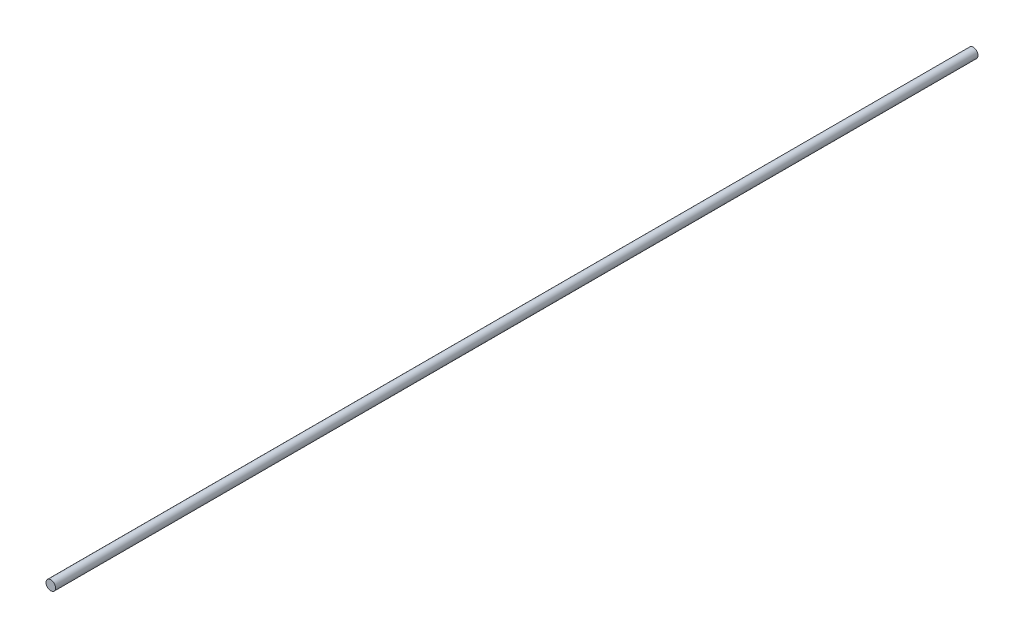
ISO-10303-21;
HEADER;
FILE_DESCRIPTION(('STEP AP214'),'2;1');
FILE_NAME('part.step','',(''),(''),'','','');
FILE_SCHEMA(('AUTOMOTIVE_DESIGN { 1 0 10303 214 1 1 1 1 }'));
ENDSEC;
DATA;
#1=APPLICATION_CONTEXT('core data for automotive mechanical design processes');
#2=APPLICATION_PROTOCOL_DEFINITION('international standard','automotive_design',2000,#1);
#3=PRODUCT_CONTEXT('',#1,'mechanical');
#4=PRODUCT('Part','Part','',(#3));
#5=PRODUCT_RELATED_PRODUCT_CATEGORY('part','',(#4));
#6=PRODUCT_DEFINITION_FORMATION('','',#4);
#7=PRODUCT_DEFINITION_CONTEXT('part definition',#1,'design');
#8=PRODUCT_DEFINITION('design','',#6,#7);
#9=PRODUCT_DEFINITION_SHAPE('','',#8);
#10=(LENGTH_UNIT() NAMED_UNIT(*) SI_UNIT(.MILLI.,.METRE.));
#11=(NAMED_UNIT(*) PLANE_ANGLE_UNIT() SI_UNIT($,.RADIAN.));
#12=(NAMED_UNIT(*) SI_UNIT($,.STERADIAN.) SOLID_ANGLE_UNIT());
#13=UNCERTAINTY_MEASURE_WITH_UNIT(LENGTH_MEASURE(1.E-05),#10,'distance_accuracy_value','');
#14=(GEOMETRIC_REPRESENTATION_CONTEXT(3) GLOBAL_UNCERTAINTY_ASSIGNED_CONTEXT((#13)) GLOBAL_UNIT_ASSIGNED_CONTEXT((#10,
#11,#12)) REPRESENTATION_CONTEXT('',''));
#15=CARTESIAN_POINT('',(0.,0.,0.));
#16=DIRECTION('',(0.,0.,1.));
#17=DIRECTION('',(1.,0.,0.));
#18=AXIS2_PLACEMENT_3D('',#15,#16,#17);
#19=CARTESIAN_POINT('',(0.,0.,770.));
#20=DIRECTION('',(0.,0.,-1.));
#21=DIRECTION('',(-1.,0.,0.));
#22=AXIS2_PLACEMENT_3D('',#19,#20,#21);
#23=CYLINDRICAL_SURFACE('',#22,4.);
#24=CARTESIAN_POINT('',(0.,0.,770.));
#25=DIRECTION('',(0.,0.,1.));
#26=DIRECTION('',(1.,0.,0.));
#27=AXIS2_PLACEMENT_3D('',#24,#25,#26);
#28=CIRCLE('',#27,4.);
#29=CARTESIAN_POINT('',(4.,0.,770.));
#30=VERTEX_POINT('',#29);
#31=EDGE_CURVE('E10',#30,#30,#28,.T.);
#32=ORIENTED_EDGE('',*,*,#31,.F.);
#33=EDGE_LOOP('',(#32));
#34=FACE_BOUND('',#33,.T.);
#35=CARTESIAN_POINT('',(0.,0.,0.));
#36=DIRECTION('',(0.,0.,1.));
#37=DIRECTION('',(1.,0.,0.));
#38=AXIS2_PLACEMENT_3D('',#35,#36,#37);
#39=CIRCLE('',#38,4.);
#40=CARTESIAN_POINT('',(4.,0.,0.));
#41=VERTEX_POINT('',#40);
#42=EDGE_CURVE('E39',#41,#41,#39,.T.);
#43=ORIENTED_EDGE('',*,*,#42,.T.);
#44=EDGE_LOOP('',(#43));
#45=FACE_BOUND('',#44,.T.);
#46=ADVANCED_FACE('F36',(#34,#45),#23,.T.);
#47=CARTESIAN_POINT('',(0.,0.,770.));
#48=DIRECTION('',(0.,0.,1.));
#49=DIRECTION('',(1.,0.,0.));
#50=AXIS2_PLACEMENT_3D('',#47,#48,#49);
#51=PLANE('',#50);
#52=ORIENTED_EDGE('',*,*,#31,.T.);
#53=EDGE_LOOP('',(#52));
#54=FACE_BOUND('',#53,.T.);
#55=ADVANCED_FACE('F51',(#54),#51,.T.);
#56=CARTESIAN_POINT('',(0.,0.,0.));
#57=DIRECTION('',(0.,0.,1.));
#58=DIRECTION('',(1.,0.,0.));
#59=AXIS2_PLACEMENT_3D('',#56,#57,#58);
#60=PLANE('',#59);
#61=ORIENTED_EDGE('',*,*,#42,.F.);
#62=EDGE_LOOP('',(#61));
#63=FACE_BOUND('',#62,.T.);
#64=ADVANCED_FACE('F49',(#63),#60,.F.);
#65=CLOSED_SHELL('',(#46,#55,#64));
#66=MANIFOLD_SOLID_BREP('B2',#65);
#67=ADVANCED_BREP_SHAPE_REPRESENTATION('',(#18,#66),#14);
#68=SHAPE_DEFINITION_REPRESENTATION(#9,#67);
ENDSEC;
END-ISO-10303-21;
